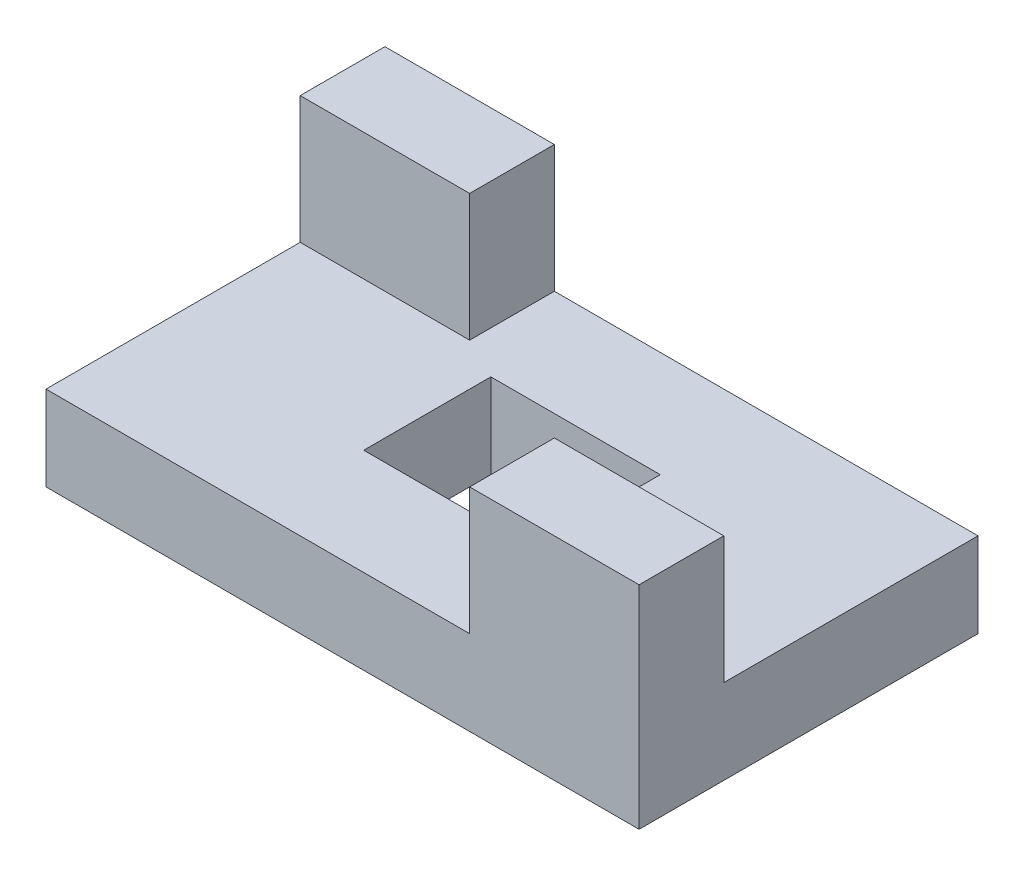
ISO-10303-21;
HEADER;
FILE_DESCRIPTION(('STEP AP214'),'2;1');
FILE_NAME('part.step','',(''),(''),'','','');
FILE_SCHEMA(('AUTOMOTIVE_DESIGN { 1 0 10303 214 1 1 1 1 }'));
ENDSEC;
DATA;
#1=APPLICATION_CONTEXT('core data for automotive mechanical design processes');
#2=APPLICATION_PROTOCOL_DEFINITION('international standard','automotive_design',2000,#1);
#3=PRODUCT_CONTEXT('',#1,'mechanical');
#4=PRODUCT('Part','Part','',(#3));
#5=PRODUCT_RELATED_PRODUCT_CATEGORY('part','',(#4));
#6=PRODUCT_DEFINITION_FORMATION('','',#4);
#7=PRODUCT_DEFINITION_CONTEXT('part definition',#1,'design');
#8=PRODUCT_DEFINITION('design','',#6,#7);
#9=PRODUCT_DEFINITION_SHAPE('','',#8);
#10=(LENGTH_UNIT() NAMED_UNIT(*) SI_UNIT(.MILLI.,.METRE.));
#11=(NAMED_UNIT(*) PLANE_ANGLE_UNIT() SI_UNIT($,.RADIAN.));
#12=(NAMED_UNIT(*) SI_UNIT($,.STERADIAN.) SOLID_ANGLE_UNIT());
#13=UNCERTAINTY_MEASURE_WITH_UNIT(LENGTH_MEASURE(1.E-05),#10,'distance_accuracy_value','');
#14=(GEOMETRIC_REPRESENTATION_CONTEXT(3) GLOBAL_UNCERTAINTY_ASSIGNED_CONTEXT((#13)) GLOBAL_UNIT_ASSIGNED_CONTEXT((#10,
#11,#12)) REPRESENTATION_CONTEXT('',''));
#15=CARTESIAN_POINT('',(0.,0.,0.));
#16=DIRECTION('',(0.,0.,1.));
#17=DIRECTION('',(1.,0.,0.));
#18=AXIS2_PLACEMENT_3D('',#15,#16,#17);
#19=CARTESIAN_POINT('',(0.,8.,16.));
#20=DIRECTION('',(0.,0.,-1.));
#21=DIRECTION('',(-1.,0.,0.));
#22=AXIS2_PLACEMENT_3D('',#19,#20,#21);
#23=PLANE('',#22);
#24=DIRECTION('',(1.,0.,0.));
#25=VECTOR('',#24,1.);
#26=CARTESIAN_POINT('',(0.,0.,16.));
#27=LINE('',#26,#25);
#28=CARTESIAN_POINT('',(-28.,0.,16.));
#29=VERTEX_POINT('',#28);
#30=CARTESIAN_POINT('',(28.,0.,16.));
#31=VERTEX_POINT('',#30);
#32=EDGE_CURVE('E167',#29,#31,#27,.T.);
#33=ORIENTED_EDGE('',*,*,#32,.T.);
#34=DIRECTION('',(0.,-1.,0.));
#35=VECTOR('',#34,1.);
#36=CARTESIAN_POINT('',(28.,20.,16.));
#37=LINE('',#36,#35);
#38=CARTESIAN_POINT('',(28.,20.,16.));
#39=VERTEX_POINT('',#38);
#40=EDGE_CURVE('E291',#39,#31,#37,.T.);
#41=ORIENTED_EDGE('',*,*,#40,.F.);
#42=DIRECTION('',(1.,0.,0.));
#43=VECTOR('',#42,1.);
#44=CARTESIAN_POINT('',(0.,20.,16.));
#45=LINE('',#44,#43);
#46=CARTESIAN_POINT('',(12.,20.,16.));
#47=VERTEX_POINT('',#46);
#48=EDGE_CURVE('E277',#47,#39,#45,.T.);
#49=ORIENTED_EDGE('',*,*,#48,.F.);
#50=DIRECTION('',(0.,-1.,0.));
#51=VECTOR('',#50,1.);
#52=CARTESIAN_POINT('',(12.,20.,16.));
#53=LINE('',#52,#51);
#54=CARTESIAN_POINT('',(12.,8.,16.));
#55=VERTEX_POINT('',#54);
#56=EDGE_CURVE('E136',#47,#55,#53,.T.);
#57=ORIENTED_EDGE('',*,*,#56,.T.);
#58=DIRECTION('',(1.,0.,0.));
#59=VECTOR('',#58,1.);
#60=CARTESIAN_POINT('',(0.,8.,16.));
#61=LINE('',#60,#59);
#62=CARTESIAN_POINT('',(-28.,8.,16.));
#63=VERTEX_POINT('',#62);
#64=EDGE_CURVE('E117',#63,#55,#61,.T.);
#65=ORIENTED_EDGE('',*,*,#64,.F.);
#66=DIRECTION('',(0.,-1.,0.));
#67=VECTOR('',#66,1.);
#68=CARTESIAN_POINT('',(-28.,8.,16.));
#69=LINE('',#68,#67);
#70=EDGE_CURVE('E51',#63,#29,#69,.T.);
#71=ORIENTED_EDGE('',*,*,#70,.T.);
#72=EDGE_LOOP('',(#33,#41,#49,#57,#65,#71));
#73=FACE_BOUND('',#72,.T.);
#74=ADVANCED_FACE('F41',(#73),#23,.F.);
#75=CARTESIAN_POINT('',(28.,8.,0.));
#76=DIRECTION('',(-1.,0.,0.));
#77=DIRECTION('',(0.,0.,1.));
#78=AXIS2_PLACEMENT_3D('',#75,#76,#77);
#79=PLANE('',#78);
#80=DIRECTION('',(0.,0.,-1.));
#81=VECTOR('',#80,1.);
#82=CARTESIAN_POINT('',(28.,0.,0.));
#83=LINE('',#82,#81);
#84=CARTESIAN_POINT('',(28.,0.,-16.));
#85=VERTEX_POINT('',#84);
#86=EDGE_CURVE('E169',#31,#85,#83,.T.);
#87=ORIENTED_EDGE('',*,*,#86,.T.);
#88=DIRECTION('',(0.,-1.,0.));
#89=VECTOR('',#88,1.);
#90=CARTESIAN_POINT('',(28.,8.,-16.));
#91=LINE('',#90,#89);
#92=CARTESIAN_POINT('',(28.,8.,-16.));
#93=VERTEX_POINT('',#92);
#94=EDGE_CURVE('E11',#93,#85,#91,.T.);
#95=ORIENTED_EDGE('',*,*,#94,.F.);
#96=DIRECTION('',(0.,0.,-1.));
#97=VECTOR('',#96,1.);
#98=CARTESIAN_POINT('',(28.,8.,0.));
#99=LINE('',#98,#97);
#100=CARTESIAN_POINT('',(28.,8.,8.00000000000001));
#101=VERTEX_POINT('',#100);
#102=EDGE_CURVE('E148',#101,#93,#99,.T.);
#103=ORIENTED_EDGE('',*,*,#102,.F.);
#104=DIRECTION('',(0.,-1.,0.));
#105=VECTOR('',#104,1.);
#106=CARTESIAN_POINT('',(28.,20.,8.00000000000001));
#107=LINE('',#106,#105);
#108=CARTESIAN_POINT('',(28.,20.,8.00000000000001));
#109=VERTEX_POINT('',#108);
#110=EDGE_CURVE('E289',#109,#101,#107,.T.);
#111=ORIENTED_EDGE('',*,*,#110,.F.);
#112=DIRECTION('',(0.,0.,-1.));
#113=VECTOR('',#112,1.);
#114=CARTESIAN_POINT('',(28.,20.,0.));
#115=LINE('',#114,#113);
#116=EDGE_CURVE('E280',#39,#109,#115,.T.);
#117=ORIENTED_EDGE('',*,*,#116,.F.);
#118=ORIENTED_EDGE('',*,*,#40,.T.);
#119=EDGE_LOOP('',(#87,#95,#103,#111,#117,#118));
#120=FACE_BOUND('',#119,.T.);
#121=ADVANCED_FACE('F193',(#120),#79,.F.);
#122=CARTESIAN_POINT('',(0.,8.,-16.));
#123=DIRECTION('',(0.,0.,-1.));
#124=DIRECTION('',(-1.,0.,0.));
#125=AXIS2_PLACEMENT_3D('',#122,#123,#124);
#126=PLANE('',#125);
#127=DIRECTION('',(1.,0.,0.));
#128=VECTOR('',#127,1.);
#129=CARTESIAN_POINT('',(0.,0.,-16.));
#130=LINE('',#129,#128);
#131=CARTESIAN_POINT('',(-28.,0.,-16.));
#132=VERTEX_POINT('',#131);
#133=EDGE_CURVE('E133',#132,#85,#130,.T.);
#134=ORIENTED_EDGE('',*,*,#133,.F.);
#135=DIRECTION('',(0.,-1.,0.));
#136=VECTOR('',#135,1.);
#137=CARTESIAN_POINT('',(-28.,20.,-16.));
#138=LINE('',#137,#136);
#139=CARTESIAN_POINT('',(-28.,20.,-16.));
#140=VERTEX_POINT('',#139);
#141=EDGE_CURVE('E261',#140,#132,#138,.T.);
#142=ORIENTED_EDGE('',*,*,#141,.F.);
#143=DIRECTION('',(1.,0.,0.));
#144=VECTOR('',#143,1.);
#145=CARTESIAN_POINT('',(0.,20.,-16.));
#146=LINE('',#145,#144);
#147=CARTESIAN_POINT('',(-12.,20.,-16.));
#148=VERTEX_POINT('',#147);
#149=EDGE_CURVE('E244',#140,#148,#146,.T.);
#150=ORIENTED_EDGE('',*,*,#149,.T.);
#151=DIRECTION('',(0.,-1.,0.));
#152=VECTOR('',#151,1.);
#153=CARTESIAN_POINT('',(-12.,20.,-16.));
#154=LINE('',#153,#152);
#155=CARTESIAN_POINT('',(-12.,8.,-16.));
#156=VERTEX_POINT('',#155);
#157=EDGE_CURVE('E258',#148,#156,#154,.T.);
#158=ORIENTED_EDGE('',*,*,#157,.T.);
#159=DIRECTION('',(1.,0.,0.));
#160=VECTOR('',#159,1.);
#161=CARTESIAN_POINT('',(0.,8.,-16.));
#162=LINE('',#161,#160);
#163=EDGE_CURVE('E150',#156,#93,#162,.T.);
#164=ORIENTED_EDGE('',*,*,#163,.T.);
#165=ORIENTED_EDGE('',*,*,#94,.T.);
#166=EDGE_LOOP('',(#134,#142,#150,#158,#164,#165));
#167=FACE_BOUND('',#166,.T.);
#168=ADVANCED_FACE('F198',(#167),#126,.T.);
#169=CARTESIAN_POINT('',(8.,8.,0.));
#170=DIRECTION('',(-1.,0.,0.));
#171=DIRECTION('',(0.,0.,1.));
#172=AXIS2_PLACEMENT_3D('',#169,#170,#171);
#173=PLANE('',#172);
#174=DIRECTION('',(0.,0.,-1.));
#175=VECTOR('',#174,1.);
#176=CARTESIAN_POINT('',(8.,0.,0.));
#177=LINE('',#176,#175);
#178=CARTESIAN_POINT('',(8.,0.,6.));
#179=VERTEX_POINT('',#178);
#180=CARTESIAN_POINT('',(8.,0.,-6.));
#181=VERTEX_POINT('',#180);
#182=EDGE_CURVE('E159',#179,#181,#177,.T.);
#183=ORIENTED_EDGE('',*,*,#182,.F.);
#184=DIRECTION('',(0.,-1.,0.));
#185=VECTOR('',#184,1.);
#186=CARTESIAN_POINT('',(8.,8.,6.));
#187=LINE('',#186,#185);
#188=CARTESIAN_POINT('',(8.,8.,6.));
#189=VERTEX_POINT('',#188);
#190=EDGE_CURVE('E45',#189,#179,#187,.T.);
#191=ORIENTED_EDGE('',*,*,#190,.F.);
#192=DIRECTION('',(0.,0.,-1.));
#193=VECTOR('',#192,1.);
#194=CARTESIAN_POINT('',(8.,8.,0.));
#195=LINE('',#194,#193);
#196=CARTESIAN_POINT('',(8.,8.,-6.));
#197=VERTEX_POINT('',#196);
#198=EDGE_CURVE('E110',#189,#197,#195,.T.);
#199=ORIENTED_EDGE('',*,*,#198,.T.);
#200=DIRECTION('',(0.,-1.,0.));
#201=VECTOR('',#200,1.);
#202=CARTESIAN_POINT('',(8.,8.,-6.));
#203=LINE('',#202,#201);
#204=EDGE_CURVE('E120',#197,#181,#203,.T.);
#205=ORIENTED_EDGE('',*,*,#204,.T.);
#206=EDGE_LOOP('',(#183,#191,#199,#205));
#207=FACE_BOUND('',#206,.T.);
#208=ADVANCED_FACE('F43',(#207),#173,.T.);
#209=CARTESIAN_POINT('',(0.,8.,6.));
#210=DIRECTION('',(0.,0.,-1.));
#211=DIRECTION('',(-1.,0.,0.));
#212=AXIS2_PLACEMENT_3D('',#209,#210,#211);
#213=PLANE('',#212);
#214=DIRECTION('',(1.,0.,0.));
#215=VECTOR('',#214,1.);
#216=CARTESIAN_POINT('',(0.,0.,6.));
#217=LINE('',#216,#215);
#218=CARTESIAN_POINT('',(-8.,0.,6.));
#219=VERTEX_POINT('',#218);
#220=EDGE_CURVE('E161',#219,#179,#217,.T.);
#221=ORIENTED_EDGE('',*,*,#220,.F.);
#222=DIRECTION('',(0.,-1.,0.));
#223=VECTOR('',#222,1.);
#224=CARTESIAN_POINT('',(-8.,8.,6.));
#225=LINE('',#224,#223);
#226=CARTESIAN_POINT('',(-8.,8.,6.));
#227=VERTEX_POINT('',#226);
#228=EDGE_CURVE('E174',#227,#219,#225,.T.);
#229=ORIENTED_EDGE('',*,*,#228,.F.);
#230=DIRECTION('',(1.,0.,0.));
#231=VECTOR('',#230,1.);
#232=CARTESIAN_POINT('',(0.,8.,6.));
#233=LINE('',#232,#231);
#234=EDGE_CURVE('E128',#227,#189,#233,.T.);
#235=ORIENTED_EDGE('',*,*,#234,.T.);
#236=ORIENTED_EDGE('',*,*,#190,.T.);
#237=EDGE_LOOP('',(#221,#229,#235,#236));
#238=FACE_BOUND('',#237,.T.);
#239=ADVANCED_FACE('F179',(#238),#213,.T.);
#240=CARTESIAN_POINT('',(-8.,8.,0.));
#241=DIRECTION('',(-1.,0.,0.));
#242=DIRECTION('',(0.,0.,1.));
#243=AXIS2_PLACEMENT_3D('',#240,#241,#242);
#244=PLANE('',#243);
#245=DIRECTION('',(0.,0.,-1.));
#246=VECTOR('',#245,1.);
#247=CARTESIAN_POINT('',(-8.,0.,0.));
#248=LINE('',#247,#246);
#249=CARTESIAN_POINT('',(-8.,0.,-6.));
#250=VERTEX_POINT('',#249);
#251=EDGE_CURVE('E164',#219,#250,#248,.T.);
#252=ORIENTED_EDGE('',*,*,#251,.T.);
#253=DIRECTION('',(0.,-1.,0.));
#254=VECTOR('',#253,1.);
#255=CARTESIAN_POINT('',(-8.,8.,-6.));
#256=LINE('',#255,#254);
#257=CARTESIAN_POINT('',(-8.,8.,-6.));
#258=VERTEX_POINT('',#257);
#259=EDGE_CURVE('E125',#258,#250,#256,.T.);
#260=ORIENTED_EDGE('',*,*,#259,.F.);
#261=DIRECTION('',(0.,0.,-1.));
#262=VECTOR('',#261,1.);
#263=CARTESIAN_POINT('',(-8.,8.,0.));
#264=LINE('',#263,#262);
#265=EDGE_CURVE('E113',#227,#258,#264,.T.);
#266=ORIENTED_EDGE('',*,*,#265,.F.);
#267=ORIENTED_EDGE('',*,*,#228,.T.);
#268=EDGE_LOOP('',(#252,#260,#266,#267));
#269=FACE_BOUND('',#268,.T.);
#270=ADVANCED_FACE('F183',(#269),#244,.F.);
#271=CARTESIAN_POINT('',(0.,8.,-6.));
#272=DIRECTION('',(0.,0.,-1.));
#273=DIRECTION('',(-1.,0.,0.));
#274=AXIS2_PLACEMENT_3D('',#271,#272,#273);
#275=PLANE('',#274);
#276=DIRECTION('',(1.,0.,0.));
#277=VECTOR('',#276,1.);
#278=CARTESIAN_POINT('',(0.,0.,-6.));
#279=LINE('',#278,#277);
#280=EDGE_CURVE('E123',#250,#181,#279,.T.);
#281=ORIENTED_EDGE('',*,*,#280,.T.);
#282=ORIENTED_EDGE('',*,*,#204,.F.);
#283=DIRECTION('',(1.,0.,0.));
#284=VECTOR('',#283,1.);
#285=CARTESIAN_POINT('',(0.,8.,-6.));
#286=LINE('',#285,#284);
#287=EDGE_CURVE('E105',#258,#197,#286,.T.);
#288=ORIENTED_EDGE('',*,*,#287,.F.);
#289=ORIENTED_EDGE('',*,*,#259,.T.);
#290=EDGE_LOOP('',(#281,#282,#288,#289));
#291=FACE_BOUND('',#290,.T.);
#292=ADVANCED_FACE('F121',(#291),#275,.F.);
#293=CARTESIAN_POINT('',(-28.,8.,0.));
#294=DIRECTION('',(-1.,0.,0.));
#295=DIRECTION('',(0.,0.,1.));
#296=AXIS2_PLACEMENT_3D('',#293,#294,#295);
#297=PLANE('',#296);
#298=DIRECTION('',(0.,0.,-1.));
#299=VECTOR('',#298,1.);
#300=CARTESIAN_POINT('',(-28.,0.,0.));
#301=LINE('',#300,#299);
#302=EDGE_CURVE('E129',#29,#132,#301,.T.);
#303=ORIENTED_EDGE('',*,*,#302,.F.);
#304=ORIENTED_EDGE('',*,*,#70,.F.);
#305=DIRECTION('',(0.,0.,-1.));
#306=VECTOR('',#305,1.);
#307=CARTESIAN_POINT('',(-28.,8.,0.));
#308=LINE('',#307,#306);
#309=CARTESIAN_POINT('',(-28.,8.,-8.));
#310=VERTEX_POINT('',#309);
#311=EDGE_CURVE('E126',#63,#310,#308,.T.);
#312=ORIENTED_EDGE('',*,*,#311,.T.);
#313=DIRECTION('',(0.,-1.,0.));
#314=VECTOR('',#313,1.);
#315=CARTESIAN_POINT('',(-28.,20.,-8.));
#316=LINE('',#315,#314);
#317=CARTESIAN_POINT('',(-28.,20.,-8.));
#318=VERTEX_POINT('',#317);
#319=EDGE_CURVE('E269',#318,#310,#316,.T.);
#320=ORIENTED_EDGE('',*,*,#319,.F.);
#321=DIRECTION('',(0.,0.,-1.));
#322=VECTOR('',#321,1.);
#323=CARTESIAN_POINT('',(-28.,20.,0.));
#324=LINE('',#323,#322);
#325=EDGE_CURVE('E262',#318,#140,#324,.T.);
#326=ORIENTED_EDGE('',*,*,#325,.T.);
#327=ORIENTED_EDGE('',*,*,#141,.T.);
#328=EDGE_LOOP('',(#303,#304,#312,#320,#326,#327));
#329=FACE_BOUND('',#328,.T.);
#330=ADVANCED_FACE('F190',(#329),#297,.T.);
#331=CARTESIAN_POINT('',(0.,8.,0.));
#332=DIRECTION('',(0.,1.,0.));
#333=DIRECTION('',(0.,0.,1.));
#334=AXIS2_PLACEMENT_3D('',#331,#332,#333);
#335=PLANE('',#334);
#336=ORIENTED_EDGE('',*,*,#198,.F.);
#337=ORIENTED_EDGE('',*,*,#234,.F.);
#338=ORIENTED_EDGE('',*,*,#265,.T.);
#339=ORIENTED_EDGE('',*,*,#287,.T.);
#340=EDGE_LOOP('',(#336,#337,#338,#339));
#341=FACE_BOUND('',#340,.T.);
#342=ORIENTED_EDGE('',*,*,#64,.T.);
#343=DIRECTION('',(0.,0.,-1.));
#344=VECTOR('',#343,1.);
#345=CARTESIAN_POINT('',(12.,8.,0.));
#346=LINE('',#345,#344);
#347=CARTESIAN_POINT('',(12.,8.,8.00000000000001));
#348=VERTEX_POINT('',#347);
#349=EDGE_CURVE('E142',#55,#348,#346,.T.);
#350=ORIENTED_EDGE('',*,*,#349,.T.);
#351=DIRECTION('',(-1.,0.,0.));
#352=VECTOR('',#351,1.);
#353=CARTESIAN_POINT('',(0.,8.,8.00000000000001));
#354=LINE('',#353,#352);
#355=EDGE_CURVE('E145',#101,#348,#354,.T.);
#356=ORIENTED_EDGE('',*,*,#355,.F.);
#357=ORIENTED_EDGE('',*,*,#102,.T.);
#358=ORIENTED_EDGE('',*,*,#163,.F.);
#359=DIRECTION('',(0.,0.,1.));
#360=VECTOR('',#359,1.);
#361=CARTESIAN_POINT('',(-12.,8.,0.));
#362=LINE('',#361,#360);
#363=CARTESIAN_POINT('',(-12.,8.,-8.));
#364=VERTEX_POINT('',#363);
#365=EDGE_CURVE('E152',#156,#364,#362,.T.);
#366=ORIENTED_EDGE('',*,*,#365,.T.);
#367=DIRECTION('',(1.,0.,0.));
#368=VECTOR('',#367,1.);
#369=CARTESIAN_POINT('',(0.,8.,-8.));
#370=LINE('',#369,#368);
#371=EDGE_CURVE('E155',#310,#364,#370,.T.);
#372=ORIENTED_EDGE('',*,*,#371,.F.);
#373=ORIENTED_EDGE('',*,*,#311,.F.);
#374=EDGE_LOOP('',(#342,#350,#356,#357,#358,#366,#372,#373));
#375=FACE_BOUND('',#374,.T.);
#376=ADVANCED_FACE('F107',(#341,#375),#335,.T.);
#377=CARTESIAN_POINT('',(0.,0.,0.));
#378=DIRECTION('',(0.,1.,0.));
#379=DIRECTION('',(0.,0.,1.));
#380=AXIS2_PLACEMENT_3D('',#377,#378,#379);
#381=PLANE('',#380);
#382=ORIENTED_EDGE('',*,*,#182,.T.);
#383=ORIENTED_EDGE('',*,*,#280,.F.);
#384=ORIENTED_EDGE('',*,*,#251,.F.);
#385=ORIENTED_EDGE('',*,*,#220,.T.);
#386=EDGE_LOOP('',(#382,#383,#384,#385));
#387=FACE_BOUND('',#386,.T.);
#388=ORIENTED_EDGE('',*,*,#32,.F.);
#389=ORIENTED_EDGE('',*,*,#302,.T.);
#390=ORIENTED_EDGE('',*,*,#133,.T.);
#391=ORIENTED_EDGE('',*,*,#86,.F.);
#392=EDGE_LOOP('',(#388,#389,#390,#391));
#393=FACE_BOUND('',#392,.T.);
#394=ADVANCED_FACE('F181',(#387,#393),#381,.F.);
#395=CARTESIAN_POINT('',(12.,20.,0.));
#396=DIRECTION('',(-1.,0.,0.));
#397=DIRECTION('',(0.,0.,1.));
#398=AXIS2_PLACEMENT_3D('',#395,#396,#397);
#399=PLANE('',#398);
#400=DIRECTION('',(0.,-1.,0.));
#401=VECTOR('',#400,1.);
#402=CARTESIAN_POINT('',(12.,20.,8.00000000000001));
#403=LINE('',#402,#401);
#404=CARTESIAN_POINT('',(12.,20.,8.00000000000001));
#405=VERTEX_POINT('',#404);
#406=EDGE_CURVE('E286',#405,#348,#403,.T.);
#407=ORIENTED_EDGE('',*,*,#406,.T.);
#408=ORIENTED_EDGE('',*,*,#349,.F.);
#409=ORIENTED_EDGE('',*,*,#56,.F.);
#410=DIRECTION('',(0.,0.,-1.));
#411=VECTOR('',#410,1.);
#412=CARTESIAN_POINT('',(12.,20.,0.));
#413=LINE('',#412,#411);
#414=EDGE_CURVE('E274',#47,#405,#413,.T.);
#415=ORIENTED_EDGE('',*,*,#414,.T.);
#416=EDGE_LOOP('',(#407,#408,#409,#415));
#417=FACE_BOUND('',#416,.T.);
#418=ADVANCED_FACE('F208',(#417),#399,.T.);
#419=CARTESIAN_POINT('',(0.,20.,8.00000000000001));
#420=DIRECTION('',(0.,0.,1.));
#421=DIRECTION('',(1.,0.,0.));
#422=AXIS2_PLACEMENT_3D('',#419,#420,#421);
#423=PLANE('',#422);
#424=ORIENTED_EDGE('',*,*,#355,.T.);
#425=ORIENTED_EDGE('',*,*,#406,.F.);
#426=DIRECTION('',(-1.,0.,0.));
#427=VECTOR('',#426,1.);
#428=CARTESIAN_POINT('',(0.,20.,8.00000000000001));
#429=LINE('',#428,#427);
#430=EDGE_CURVE('E283',#109,#405,#429,.T.);
#431=ORIENTED_EDGE('',*,*,#430,.F.);
#432=ORIENTED_EDGE('',*,*,#110,.T.);
#433=EDGE_LOOP('',(#424,#425,#431,#432));
#434=FACE_BOUND('',#433,.T.);
#435=ADVANCED_FACE('F213',(#434),#423,.F.);
#436=CARTESIAN_POINT('',(0.,20.,0.));
#437=DIRECTION('',(0.,1.,0.));
#438=DIRECTION('',(0.,0.,1.));
#439=AXIS2_PLACEMENT_3D('',#436,#437,#438);
#440=PLANE('',#439);
#441=ORIENTED_EDGE('',*,*,#414,.F.);
#442=ORIENTED_EDGE('',*,*,#48,.T.);
#443=ORIENTED_EDGE('',*,*,#116,.T.);
#444=ORIENTED_EDGE('',*,*,#430,.T.);
#445=EDGE_LOOP('',(#441,#442,#443,#444));
#446=FACE_BOUND('',#445,.T.);
#447=ADVANCED_FACE('F217',(#446),#440,.T.);
#448=CARTESIAN_POINT('',(-12.,20.,0.));
#449=DIRECTION('',(1.,0.,0.));
#450=DIRECTION('',(0.,0.,-1.));
#451=AXIS2_PLACEMENT_3D('',#448,#449,#450);
#452=PLANE('',#451);
#453=DIRECTION('',(0.,-1.,0.));
#454=VECTOR('',#453,1.);
#455=CARTESIAN_POINT('',(-12.,20.,-8.));
#456=LINE('',#455,#454);
#457=CARTESIAN_POINT('',(-12.,20.,-8.));
#458=VERTEX_POINT('',#457);
#459=EDGE_CURVE('E267',#458,#364,#456,.T.);
#460=ORIENTED_EDGE('',*,*,#459,.T.);
#461=ORIENTED_EDGE('',*,*,#365,.F.);
#462=ORIENTED_EDGE('',*,*,#157,.F.);
#463=DIRECTION('',(0.,0.,1.));
#464=VECTOR('',#463,1.);
#465=CARTESIAN_POINT('',(-12.,20.,0.));
#466=LINE('',#465,#464);
#467=EDGE_CURVE('E240',#148,#458,#466,.T.);
#468=ORIENTED_EDGE('',*,*,#467,.T.);
#469=EDGE_LOOP('',(#460,#461,#462,#468));
#470=FACE_BOUND('',#469,.T.);
#471=ADVANCED_FACE('F221',(#470),#452,.T.);
#472=CARTESIAN_POINT('',(0.,20.,-8.));
#473=DIRECTION('',(0.,0.,-1.));
#474=DIRECTION('',(-1.,0.,0.));
#475=AXIS2_PLACEMENT_3D('',#472,#473,#474);
#476=PLANE('',#475);
#477=ORIENTED_EDGE('',*,*,#371,.T.);
#478=ORIENTED_EDGE('',*,*,#459,.F.);
#479=DIRECTION('',(1.,0.,0.));
#480=VECTOR('',#479,1.);
#481=CARTESIAN_POINT('',(0.,20.,-8.));
#482=LINE('',#481,#480);
#483=EDGE_CURVE('E248',#318,#458,#482,.T.);
#484=ORIENTED_EDGE('',*,*,#483,.F.);
#485=ORIENTED_EDGE('',*,*,#319,.T.);
#486=EDGE_LOOP('',(#477,#478,#484,#485));
#487=FACE_BOUND('',#486,.T.);
#488=ADVANCED_FACE('F225',(#487),#476,.F.);
#489=CARTESIAN_POINT('',(0.,20.,0.));
#490=DIRECTION('',(0.,1.,0.));
#491=DIRECTION('',(0.,0.,1.));
#492=AXIS2_PLACEMENT_3D('',#489,#490,#491);
#493=PLANE('',#492);
#494=ORIENTED_EDGE('',*,*,#467,.F.);
#495=ORIENTED_EDGE('',*,*,#149,.F.);
#496=ORIENTED_EDGE('',*,*,#325,.F.);
#497=ORIENTED_EDGE('',*,*,#483,.T.);
#498=EDGE_LOOP('',(#494,#495,#496,#497));
#499=FACE_BOUND('',#498,.T.);
#500=ADVANCED_FACE('F229',(#499),#493,.T.);
#501=CLOSED_SHELL('',(#74,#121,#168,#208,#239,#270,#292,#330,#376,#394,#418,#435,#447,#471,#488,#500));
#502=MANIFOLD_SOLID_BREP('B2',#501);
#503=ADVANCED_BREP_SHAPE_REPRESENTATION('',(#18,#502),#14);
#504=SHAPE_DEFINITION_REPRESENTATION(#9,#503);
ENDSEC;
END-ISO-10303-21;
